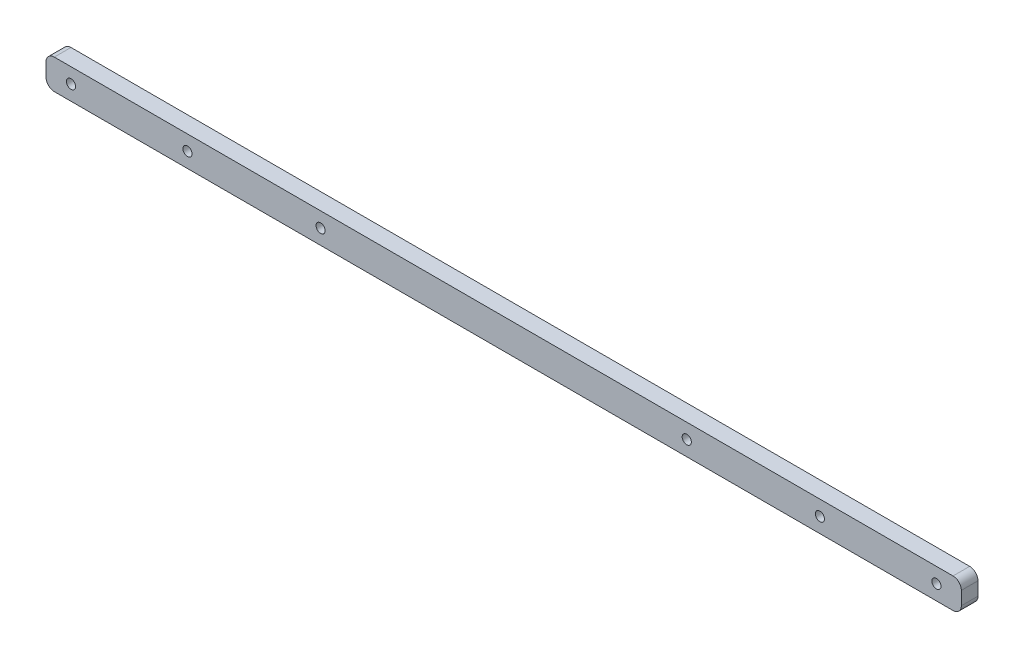
ISO-10303-21;
HEADER;
FILE_DESCRIPTION(('STEP AP214'),'2;1');
FILE_NAME('part.step','',(''),(''),'','','');
FILE_SCHEMA(('AUTOMOTIVE_DESIGN { 1 0 10303 214 1 1 1 1 }'));
ENDSEC;
DATA;
#1=APPLICATION_CONTEXT('core data for automotive mechanical design processes');
#2=APPLICATION_PROTOCOL_DEFINITION('international standard','automotive_design',2000,#1);
#3=PRODUCT_CONTEXT('',#1,'mechanical');
#4=PRODUCT('Part','Part','',(#3));
#5=PRODUCT_RELATED_PRODUCT_CATEGORY('part','',(#4));
#6=PRODUCT_DEFINITION_FORMATION('','',#4);
#7=PRODUCT_DEFINITION_CONTEXT('part definition',#1,'design');
#8=PRODUCT_DEFINITION('design','',#6,#7);
#9=PRODUCT_DEFINITION_SHAPE('','',#8);
#10=(LENGTH_UNIT() NAMED_UNIT(*) SI_UNIT(.MILLI.,.METRE.));
#11=(NAMED_UNIT(*) PLANE_ANGLE_UNIT() SI_UNIT($,.RADIAN.));
#12=(NAMED_UNIT(*) SI_UNIT($,.STERADIAN.) SOLID_ANGLE_UNIT());
#13=UNCERTAINTY_MEASURE_WITH_UNIT(LENGTH_MEASURE(1.E-05),#10,'distance_accuracy_value','');
#14=(GEOMETRIC_REPRESENTATION_CONTEXT(3) GLOBAL_UNCERTAINTY_ASSIGNED_CONTEXT((#13)) GLOBAL_UNIT_ASSIGNED_CONTEXT((#10,
#11,#12)) REPRESENTATION_CONTEXT('',''));
#15=CARTESIAN_POINT('',(0.,0.,0.));
#16=DIRECTION('',(0.,0.,1.));
#17=DIRECTION('',(1.,0.,0.));
#18=AXIS2_PLACEMENT_3D('',#15,#16,#17);
#19=CARTESIAN_POINT('',(0.,0.,10.));
#20=DIRECTION('',(0.,0.,1.));
#21=DIRECTION('',(1.,0.,0.));
#22=AXIS2_PLACEMENT_3D('',#19,#20,#21);
#23=PLANE('',#22);
#24=CARTESIAN_POINT('',(165.,-9.00000000000008,10.));
#25=DIRECTION('',(0.,0.,1.));
#26=DIRECTION('',(-1.,0.,0.));
#27=AXIS2_PLACEMENT_3D('',#24,#25,#26);
#28=CIRCLE('',#27,2.75000000000001);
#29=CARTESIAN_POINT('',(162.25,-9.00000000000008,10.));
#30=VERTEX_POINT('',#29);
#31=EDGE_CURVE('E207',#30,#30,#28,.T.);
#32=ORIENTED_EDGE('',*,*,#31,.F.);
#33=EDGE_LOOP('',(#32));
#34=FACE_BOUND('',#33,.T.);
#35=CARTESIAN_POINT('',(385.,-9.00000000000005,10.));
#36=DIRECTION('',(0.,0.,1.));
#37=DIRECTION('',(1.,0.,0.));
#38=AXIS2_PLACEMENT_3D('',#35,#36,#37);
#39=CIRCLE('',#38,2.74999999999998);
#40=CARTESIAN_POINT('',(387.75,-9.00000000000005,10.));
#41=VERTEX_POINT('',#40);
#42=EDGE_CURVE('E201',#41,#41,#39,.T.);
#43=ORIENTED_EDGE('',*,*,#42,.F.);
#44=EDGE_LOOP('',(#43));
#45=FACE_BOUND('',#44,.T.);
#46=CARTESIAN_POINT('',(465.,-9.,10.));
#47=DIRECTION('',(0.,0.,1.));
#48=DIRECTION('',(-1.,0.,0.));
#49=AXIS2_PLACEMENT_3D('',#46,#47,#48);
#50=CIRCLE('',#49,2.74999999999998);
#51=CARTESIAN_POINT('',(462.25,-9.,10.));
#52=VERTEX_POINT('',#51);
#53=EDGE_CURVE('E186',#52,#52,#50,.T.);
#54=ORIENTED_EDGE('',*,*,#53,.F.);
#55=EDGE_LOOP('',(#54));
#56=FACE_BOUND('',#55,.T.);
#57=CARTESIAN_POINT('',(15.,-9.,10.));
#58=DIRECTION('',(0.,0.,1.));
#59=DIRECTION('',(1.,0.,0.));
#60=AXIS2_PLACEMENT_3D('',#57,#58,#59);
#61=CIRCLE('',#60,2.75);
#62=CARTESIAN_POINT('',(17.75,-9.,10.));
#63=VERTEX_POINT('',#62);
#64=EDGE_CURVE('E170',#63,#63,#61,.T.);
#65=ORIENTED_EDGE('',*,*,#64,.F.);
#66=EDGE_LOOP('',(#65));
#67=FACE_BOUND('',#66,.T.);
#68=DIRECTION('',(0.,1.,0.));
#69=VECTOR('',#68,1.);
#70=CARTESIAN_POINT('',(550.,0.,10.));
#71=LINE('',#70,#69);
#72=CARTESIAN_POINT('',(550.,-13.,10.));
#73=VERTEX_POINT('',#72);
#74=CARTESIAN_POINT('',(550.,-5.,10.));
#75=VERTEX_POINT('',#74);
#76=EDGE_CURVE('E174',#73,#75,#71,.T.);
#77=ORIENTED_EDGE('',*,*,#76,.T.);
#78=CARTESIAN_POINT('',(545.,-5.,10.));
#79=DIRECTION('',(0.,0.,1.));
#80=DIRECTION('',(1.,0.,0.));
#81=AXIS2_PLACEMENT_3D('',#78,#79,#80);
#82=CIRCLE('',#81,5.);
#83=CARTESIAN_POINT('',(545.,0.,10.));
#84=VERTEX_POINT('',#83);
#85=EDGE_CURVE('E151',#75,#84,#82,.T.);
#86=ORIENTED_EDGE('',*,*,#85,.T.);
#87=DIRECTION('',(-1.,0.,0.));
#88=VECTOR('',#87,1.);
#89=CARTESIAN_POINT('',(0.,0.,10.));
#90=LINE('',#89,#88);
#91=CARTESIAN_POINT('',(5.,0.,10.));
#92=VERTEX_POINT('',#91);
#93=EDGE_CURVE('E122',#84,#92,#90,.T.);
#94=ORIENTED_EDGE('',*,*,#93,.T.);
#95=CARTESIAN_POINT('',(5.,-5.,10.));
#96=DIRECTION('',(0.,0.,1.));
#97=DIRECTION('',(1.,0.,0.));
#98=AXIS2_PLACEMENT_3D('',#95,#96,#97);
#99=CIRCLE('',#98,5.);
#100=CARTESIAN_POINT('',(0.,-5.,10.));
#101=VERTEX_POINT('',#100);
#102=EDGE_CURVE('E147',#92,#101,#99,.T.);
#103=ORIENTED_EDGE('',*,*,#102,.T.);
#104=DIRECTION('',(0.,-1.,0.));
#105=VECTOR('',#104,1.);
#106=CARTESIAN_POINT('',(0.,0.,10.));
#107=LINE('',#106,#105);
#108=CARTESIAN_POINT('',(0.,-13.,10.));
#109=VERTEX_POINT('',#108);
#110=EDGE_CURVE('E130',#101,#109,#107,.T.);
#111=ORIENTED_EDGE('',*,*,#110,.T.);
#112=CARTESIAN_POINT('',(5.,-13.,10.));
#113=DIRECTION('',(0.,0.,1.));
#114=DIRECTION('',(1.,0.,0.));
#115=AXIS2_PLACEMENT_3D('',#112,#113,#114);
#116=CIRCLE('',#115,5.);
#117=CARTESIAN_POINT('',(5.,-18.,10.));
#118=VERTEX_POINT('',#117);
#119=EDGE_CURVE('E57',#109,#118,#116,.T.);
#120=ORIENTED_EDGE('',*,*,#119,.T.);
#121=DIRECTION('',(1.,0.,0.));
#122=VECTOR('',#121,1.);
#123=CARTESIAN_POINT('',(0.,-18.,10.));
#124=LINE('',#123,#122);
#125=CARTESIAN_POINT('',(545.,-18.,10.));
#126=VERTEX_POINT('',#125);
#127=EDGE_CURVE('E133',#118,#126,#124,.T.);
#128=ORIENTED_EDGE('',*,*,#127,.T.);
#129=CARTESIAN_POINT('',(545.,-13.,10.));
#130=DIRECTION('',(0.,0.,1.));
#131=DIRECTION('',(1.,0.,0.));
#132=AXIS2_PLACEMENT_3D('',#129,#130,#131);
#133=CIRCLE('',#132,5.);
#134=EDGE_CURVE('E149',#126,#73,#133,.T.);
#135=ORIENTED_EDGE('',*,*,#134,.T.);
#136=EDGE_LOOP('',(#77,#86,#94,#103,#111,#120,#128,#135));
#137=FACE_BOUND('',#136,.T.);
#138=CARTESIAN_POINT('',(85.,-9.,10.));
#139=DIRECTION('',(0.,0.,1.));
#140=DIRECTION('',(1.,0.,0.));
#141=AXIS2_PLACEMENT_3D('',#138,#139,#140);
#142=CIRCLE('',#141,2.75000000000001);
#143=CARTESIAN_POINT('',(87.75,-9.,10.));
#144=VERTEX_POINT('',#143);
#145=EDGE_CURVE('E180',#144,#144,#142,.T.);
#146=ORIENTED_EDGE('',*,*,#145,.F.);
#147=EDGE_LOOP('',(#146));
#148=FACE_BOUND('',#147,.T.);
#149=CARTESIAN_POINT('',(535.,-9.,10.));
#150=DIRECTION('',(0.,0.,1.));
#151=DIRECTION('',(-1.,0.,0.));
#152=AXIS2_PLACEMENT_3D('',#149,#150,#151);
#153=CIRCLE('',#152,2.75000000000004);
#154=CARTESIAN_POINT('',(532.25,-9.,10.));
#155=VERTEX_POINT('',#154);
#156=EDGE_CURVE('E192',#155,#155,#153,.T.);
#157=ORIENTED_EDGE('',*,*,#156,.F.);
#158=EDGE_LOOP('',(#157));
#159=FACE_BOUND('',#158,.T.);
#160=ADVANCED_FACE('F35',(#34,#45,#56,#67,#137,#148,#159),#23,.T.);
#161=CARTESIAN_POINT('',(0.,0.,0.));
#162=DIRECTION('',(0.,0.,1.));
#163=DIRECTION('',(1.,0.,0.));
#164=AXIS2_PLACEMENT_3D('',#161,#162,#163);
#165=PLANE('',#164);
#166=CARTESIAN_POINT('',(165.,-9.00000000000008,0.));
#167=DIRECTION('',(0.,0.,1.));
#168=DIRECTION('',(-1.,0.,0.));
#169=AXIS2_PLACEMENT_3D('',#166,#167,#168);
#170=CIRCLE('',#169,2.75000000000001);
#171=CARTESIAN_POINT('',(162.25,-9.00000000000008,0.));
#172=VERTEX_POINT('',#171);
#173=EDGE_CURVE('E204',#172,#172,#170,.T.);
#174=ORIENTED_EDGE('',*,*,#173,.T.);
#175=EDGE_LOOP('',(#174));
#176=FACE_BOUND('',#175,.T.);
#177=CARTESIAN_POINT('',(385.,-9.00000000000005,0.));
#178=DIRECTION('',(0.,0.,1.));
#179=DIRECTION('',(1.,0.,0.));
#180=AXIS2_PLACEMENT_3D('',#177,#178,#179);
#181=CIRCLE('',#180,2.74999999999998);
#182=CARTESIAN_POINT('',(387.75,-9.00000000000005,0.));
#183=VERTEX_POINT('',#182);
#184=EDGE_CURVE('E198',#183,#183,#181,.T.);
#185=ORIENTED_EDGE('',*,*,#184,.T.);
#186=EDGE_LOOP('',(#185));
#187=FACE_BOUND('',#186,.T.);
#188=DIRECTION('',(-1.,0.,0.));
#189=VECTOR('',#188,1.);
#190=CARTESIAN_POINT('',(0.,0.,0.));
#191=LINE('',#190,#189);
#192=CARTESIAN_POINT('',(545.,0.,0.));
#193=VERTEX_POINT('',#192);
#194=CARTESIAN_POINT('',(5.,0.,0.));
#195=VERTEX_POINT('',#194);
#196=EDGE_CURVE('E119',#193,#195,#191,.T.);
#197=ORIENTED_EDGE('',*,*,#196,.F.);
#198=CARTESIAN_POINT('',(545.,-5.,0.));
#199=DIRECTION('',(0.,0.,1.));
#200=DIRECTION('',(1.,0.,0.));
#201=AXIS2_PLACEMENT_3D('',#198,#199,#200);
#202=CIRCLE('',#201,5.);
#203=CARTESIAN_POINT('',(550.,-5.,0.));
#204=VERTEX_POINT('',#203);
#205=EDGE_CURVE('E102',#193,#204,#202,.F.);
#206=ORIENTED_EDGE('',*,*,#205,.T.);
#207=DIRECTION('',(0.,1.,0.));
#208=VECTOR('',#207,1.);
#209=CARTESIAN_POINT('',(550.,0.,0.));
#210=LINE('',#209,#208);
#211=CARTESIAN_POINT('',(550.,-13.,0.));
#212=VERTEX_POINT('',#211);
#213=EDGE_CURVE('E131',#212,#204,#210,.T.);
#214=ORIENTED_EDGE('',*,*,#213,.F.);
#215=CARTESIAN_POINT('',(545.,-13.,0.));
#216=DIRECTION('',(0.,0.,1.));
#217=DIRECTION('',(1.,0.,0.));
#218=AXIS2_PLACEMENT_3D('',#215,#216,#217);
#219=CIRCLE('',#218,5.);
#220=CARTESIAN_POINT('',(545.,-18.,0.));
#221=VERTEX_POINT('',#220);
#222=EDGE_CURVE('E113',#212,#221,#219,.F.);
#223=ORIENTED_EDGE('',*,*,#222,.T.);
#224=DIRECTION('',(1.,0.,0.));
#225=VECTOR('',#224,1.);
#226=CARTESIAN_POINT('',(0.,-18.,0.));
#227=LINE('',#226,#225);
#228=CARTESIAN_POINT('',(5.,-18.,0.));
#229=VERTEX_POINT('',#228);
#230=EDGE_CURVE('E135',#229,#221,#227,.T.);
#231=ORIENTED_EDGE('',*,*,#230,.F.);
#232=CARTESIAN_POINT('',(5.,-13.,0.));
#233=DIRECTION('',(0.,0.,1.));
#234=DIRECTION('',(1.,0.,0.));
#235=AXIS2_PLACEMENT_3D('',#232,#233,#234);
#236=CIRCLE('',#235,5.);
#237=CARTESIAN_POINT('',(0.,-13.,0.));
#238=VERTEX_POINT('',#237);
#239=EDGE_CURVE('E123',#229,#238,#236,.F.);
#240=ORIENTED_EDGE('',*,*,#239,.T.);
#241=DIRECTION('',(0.,-1.,0.));
#242=VECTOR('',#241,1.);
#243=CARTESIAN_POINT('',(0.,0.,0.));
#244=LINE('',#243,#242);
#245=CARTESIAN_POINT('',(0.,-5.,0.));
#246=VERTEX_POINT('',#245);
#247=EDGE_CURVE('E162',#246,#238,#244,.T.);
#248=ORIENTED_EDGE('',*,*,#247,.F.);
#249=CARTESIAN_POINT('',(5.,-5.,0.));
#250=DIRECTION('',(0.,0.,1.));
#251=DIRECTION('',(1.,0.,0.));
#252=AXIS2_PLACEMENT_3D('',#249,#250,#251);
#253=CIRCLE('',#252,5.);
#254=EDGE_CURVE('E129',#246,#195,#253,.F.);
#255=ORIENTED_EDGE('',*,*,#254,.T.);
#256=EDGE_LOOP('',(#197,#206,#214,#223,#231,#240,#248,#255));
#257=FACE_BOUND('',#256,.T.);
#258=CARTESIAN_POINT('',(15.,-9.,0.));
#259=DIRECTION('',(0.,0.,1.));
#260=DIRECTION('',(1.,0.,0.));
#261=AXIS2_PLACEMENT_3D('',#258,#259,#260);
#262=CIRCLE('',#261,2.75);
#263=CARTESIAN_POINT('',(17.75,-9.,0.));
#264=VERTEX_POINT('',#263);
#265=EDGE_CURVE('E177',#264,#264,#262,.T.);
#266=ORIENTED_EDGE('',*,*,#265,.T.);
#267=EDGE_LOOP('',(#266));
#268=FACE_BOUND('',#267,.T.);
#269=CARTESIAN_POINT('',(85.,-9.,0.));
#270=DIRECTION('',(0.,0.,1.));
#271=DIRECTION('',(1.,0.,0.));
#272=AXIS2_PLACEMENT_3D('',#269,#270,#271);
#273=CIRCLE('',#272,2.75000000000001);
#274=CARTESIAN_POINT('',(87.75,-9.,0.));
#275=VERTEX_POINT('',#274);
#276=EDGE_CURVE('E183',#275,#275,#273,.T.);
#277=ORIENTED_EDGE('',*,*,#276,.T.);
#278=EDGE_LOOP('',(#277));
#279=FACE_BOUND('',#278,.T.);
#280=CARTESIAN_POINT('',(465.,-9.,0.));
#281=DIRECTION('',(0.,0.,1.));
#282=DIRECTION('',(-1.,0.,0.));
#283=AXIS2_PLACEMENT_3D('',#280,#281,#282);
#284=CIRCLE('',#283,2.74999999999998);
#285=CARTESIAN_POINT('',(462.25,-9.,0.));
#286=VERTEX_POINT('',#285);
#287=EDGE_CURVE('E189',#286,#286,#284,.T.);
#288=ORIENTED_EDGE('',*,*,#287,.T.);
#289=EDGE_LOOP('',(#288));
#290=FACE_BOUND('',#289,.T.);
#291=CARTESIAN_POINT('',(535.,-9.,0.));
#292=DIRECTION('',(0.,0.,1.));
#293=DIRECTION('',(-1.,0.,0.));
#294=AXIS2_PLACEMENT_3D('',#291,#292,#293);
#295=CIRCLE('',#294,2.75000000000004);
#296=CARTESIAN_POINT('',(532.25,-9.,0.));
#297=VERTEX_POINT('',#296);
#298=EDGE_CURVE('E195',#297,#297,#295,.T.);
#299=ORIENTED_EDGE('',*,*,#298,.T.);
#300=EDGE_LOOP('',(#299));
#301=FACE_BOUND('',#300,.T.);
#302=ADVANCED_FACE('F126',(#176,#187,#257,#268,#279,#290,#301),#165,.F.);
#303=CARTESIAN_POINT('',(0.,0.,10.));
#304=DIRECTION('',(1.,0.,0.));
#305=DIRECTION('',(0.,1.,0.));
#306=AXIS2_PLACEMENT_3D('',#303,#304,#305);
#307=PLANE('',#306);
#308=ORIENTED_EDGE('',*,*,#110,.F.);
#309=DIRECTION('',(0.,0.,-1.));
#310=VECTOR('',#309,1.);
#311=CARTESIAN_POINT('',(0.,-5.,10.));
#312=LINE('',#311,#310);
#313=EDGE_CURVE('E11',#101,#246,#312,.T.);
#314=ORIENTED_EDGE('',*,*,#313,.T.);
#315=ORIENTED_EDGE('',*,*,#247,.T.);
#316=DIRECTION('',(0.,0.,-1.));
#317=VECTOR('',#316,1.);
#318=CARTESIAN_POINT('',(0.,-13.,10.));
#319=LINE('',#318,#317);
#320=EDGE_CURVE('E43',#238,#109,#319,.F.);
#321=ORIENTED_EDGE('',*,*,#320,.T.);
#322=EDGE_LOOP('',(#308,#314,#315,#321));
#323=FACE_BOUND('',#322,.T.);
#324=ADVANCED_FACE('F160',(#323),#307,.F.);
#325=CARTESIAN_POINT('',(0.,-18.,10.));
#326=DIRECTION('',(0.,1.,0.));
#327=DIRECTION('',(0.,0.,1.));
#328=AXIS2_PLACEMENT_3D('',#325,#326,#327);
#329=PLANE('',#328);
#330=ORIENTED_EDGE('',*,*,#230,.T.);
#331=DIRECTION('',(0.,0.,-1.));
#332=VECTOR('',#331,1.);
#333=CARTESIAN_POINT('',(545.,-18.,10.));
#334=LINE('',#333,#332);
#335=EDGE_CURVE('E50',#221,#126,#334,.F.);
#336=ORIENTED_EDGE('',*,*,#335,.T.);
#337=ORIENTED_EDGE('',*,*,#127,.F.);
#338=DIRECTION('',(0.,0.,-1.));
#339=VECTOR('',#338,1.);
#340=CARTESIAN_POINT('',(5.,-18.,10.));
#341=LINE('',#340,#339);
#342=EDGE_CURVE('E153',#118,#229,#341,.T.);
#343=ORIENTED_EDGE('',*,*,#342,.T.);
#344=EDGE_LOOP('',(#330,#336,#337,#343));
#345=FACE_BOUND('',#344,.T.);
#346=ADVANCED_FACE('F169',(#345),#329,.F.);
#347=CARTESIAN_POINT('',(550.,0.,10.));
#348=DIRECTION('',(-1.,0.,0.));
#349=DIRECTION('',(0.,0.,1.));
#350=AXIS2_PLACEMENT_3D('',#347,#348,#349);
#351=PLANE('',#350);
#352=ORIENTED_EDGE('',*,*,#213,.T.);
#353=DIRECTION('',(0.,0.,-1.));
#354=VECTOR('',#353,1.);
#355=CARTESIAN_POINT('',(550.,-5.,10.));
#356=LINE('',#355,#354);
#357=EDGE_CURVE('E107',#204,#75,#356,.F.);
#358=ORIENTED_EDGE('',*,*,#357,.T.);
#359=ORIENTED_EDGE('',*,*,#76,.F.);
#360=DIRECTION('',(0.,0.,-1.));
#361=VECTOR('',#360,1.);
#362=CARTESIAN_POINT('',(550.,-13.,10.));
#363=LINE('',#362,#361);
#364=EDGE_CURVE('E112',#73,#212,#363,.T.);
#365=ORIENTED_EDGE('',*,*,#364,.T.);
#366=EDGE_LOOP('',(#352,#358,#359,#365));
#367=FACE_BOUND('',#366,.T.);
#368=ADVANCED_FACE('F266',(#367),#351,.F.);
#369=CARTESIAN_POINT('',(0.,0.,10.));
#370=DIRECTION('',(0.,-1.,0.));
#371=DIRECTION('',(0.,0.,-1.));
#372=AXIS2_PLACEMENT_3D('',#369,#370,#371);
#373=PLANE('',#372);
#374=ORIENTED_EDGE('',*,*,#93,.F.);
#375=DIRECTION('',(0.,0.,-1.));
#376=VECTOR('',#375,1.);
#377=CARTESIAN_POINT('',(545.,0.,10.));
#378=LINE('',#377,#376);
#379=EDGE_CURVE('E106',#84,#193,#378,.T.);
#380=ORIENTED_EDGE('',*,*,#379,.T.);
#381=ORIENTED_EDGE('',*,*,#196,.T.);
#382=DIRECTION('',(0.,0.,-1.));
#383=VECTOR('',#382,1.);
#384=CARTESIAN_POINT('',(5.,0.,10.));
#385=LINE('',#384,#383);
#386=EDGE_CURVE('E124',#195,#92,#385,.F.);
#387=ORIENTED_EDGE('',*,*,#386,.T.);
#388=EDGE_LOOP('',(#374,#380,#381,#387));
#389=FACE_BOUND('',#388,.T.);
#390=ADVANCED_FACE('F118',(#389),#373,.F.);
#391=CARTESIAN_POINT('',(15.,-9.,10.));
#392=DIRECTION('',(0.,0.,-1.));
#393=DIRECTION('',(-1.,0.,0.));
#394=AXIS2_PLACEMENT_3D('',#391,#392,#393);
#395=CYLINDRICAL_SURFACE('',#394,2.75);
#396=ORIENTED_EDGE('',*,*,#64,.T.);
#397=EDGE_LOOP('',(#396));
#398=FACE_BOUND('',#397,.T.);
#399=ORIENTED_EDGE('',*,*,#265,.F.);
#400=EDGE_LOOP('',(#399));
#401=FACE_BOUND('',#400,.T.);
#402=ADVANCED_FACE('F231',(#398,#401),#395,.F.);
#403=CARTESIAN_POINT('',(85.,-9.,10.));
#404=DIRECTION('',(0.,0.,-1.));
#405=DIRECTION('',(-1.,0.,0.));
#406=AXIS2_PLACEMENT_3D('',#403,#404,#405);
#407=CYLINDRICAL_SURFACE('',#406,2.75000000000001);
#408=ORIENTED_EDGE('',*,*,#145,.T.);
#409=EDGE_LOOP('',(#408));
#410=FACE_BOUND('',#409,.T.);
#411=ORIENTED_EDGE('',*,*,#276,.F.);
#412=EDGE_LOOP('',(#411));
#413=FACE_BOUND('',#412,.T.);
#414=ADVANCED_FACE('F234',(#410,#413),#407,.F.);
#415=CARTESIAN_POINT('',(465.,-9.,10.));
#416=DIRECTION('',(0.,0.,-1.));
#417=DIRECTION('',(-1.,0.,0.));
#418=AXIS2_PLACEMENT_3D('',#415,#416,#417);
#419=CYLINDRICAL_SURFACE('',#418,2.74999999999998);
#420=ORIENTED_EDGE('',*,*,#53,.T.);
#421=EDGE_LOOP('',(#420));
#422=FACE_BOUND('',#421,.T.);
#423=ORIENTED_EDGE('',*,*,#287,.F.);
#424=EDGE_LOOP('',(#423));
#425=FACE_BOUND('',#424,.T.);
#426=ADVANCED_FACE('F248',(#422,#425),#419,.F.);
#427=CARTESIAN_POINT('',(535.,-9.,10.));
#428=DIRECTION('',(0.,0.,-1.));
#429=DIRECTION('',(-1.,0.,0.));
#430=AXIS2_PLACEMENT_3D('',#427,#428,#429);
#431=CYLINDRICAL_SURFACE('',#430,2.75000000000004);
#432=ORIENTED_EDGE('',*,*,#156,.T.);
#433=EDGE_LOOP('',(#432));
#434=FACE_BOUND('',#433,.T.);
#435=ORIENTED_EDGE('',*,*,#298,.F.);
#436=EDGE_LOOP('',(#435));
#437=FACE_BOUND('',#436,.T.);
#438=ADVANCED_FACE('F246',(#434,#437),#431,.F.);
#439=CARTESIAN_POINT('',(545.,-5.,10.));
#440=DIRECTION('',(0.,0.,-1.));
#441=DIRECTION('',(-1.,0.,0.));
#442=AXIS2_PLACEMENT_3D('',#439,#440,#441);
#443=CYLINDRICAL_SURFACE('',#442,5.);
#444=ORIENTED_EDGE('',*,*,#85,.F.);
#445=ORIENTED_EDGE('',*,*,#357,.F.);
#446=ORIENTED_EDGE('',*,*,#205,.F.);
#447=ORIENTED_EDGE('',*,*,#379,.F.);
#448=EDGE_LOOP('',(#444,#445,#446,#447));
#449=FACE_BOUND('',#448,.T.);
#450=ADVANCED_FACE('F105',(#449),#443,.T.);
#451=CARTESIAN_POINT('',(545.,-13.,10.));
#452=DIRECTION('',(0.,0.,-1.));
#453=DIRECTION('',(-1.,0.,0.));
#454=AXIS2_PLACEMENT_3D('',#451,#452,#453);
#455=CYLINDRICAL_SURFACE('',#454,5.);
#456=ORIENTED_EDGE('',*,*,#134,.F.);
#457=ORIENTED_EDGE('',*,*,#335,.F.);
#458=ORIENTED_EDGE('',*,*,#222,.F.);
#459=ORIENTED_EDGE('',*,*,#364,.F.);
#460=EDGE_LOOP('',(#456,#457,#458,#459));
#461=FACE_BOUND('',#460,.T.);
#462=ADVANCED_FACE('F255',(#461),#455,.T.);
#463=CARTESIAN_POINT('',(5.,-5.,10.));
#464=DIRECTION('',(0.,0.,-1.));
#465=DIRECTION('',(-1.,0.,0.));
#466=AXIS2_PLACEMENT_3D('',#463,#464,#465);
#467=CYLINDRICAL_SURFACE('',#466,5.);
#468=ORIENTED_EDGE('',*,*,#102,.F.);
#469=ORIENTED_EDGE('',*,*,#386,.F.);
#470=ORIENTED_EDGE('',*,*,#254,.F.);
#471=ORIENTED_EDGE('',*,*,#313,.F.);
#472=EDGE_LOOP('',(#468,#469,#470,#471));
#473=FACE_BOUND('',#472,.T.);
#474=ADVANCED_FACE('F275',(#473),#467,.T.);
#475=CARTESIAN_POINT('',(5.,-13.,10.));
#476=DIRECTION('',(0.,0.,-1.));
#477=DIRECTION('',(-1.,0.,0.));
#478=AXIS2_PLACEMENT_3D('',#475,#476,#477);
#479=CYLINDRICAL_SURFACE('',#478,5.);
#480=ORIENTED_EDGE('',*,*,#119,.F.);
#481=ORIENTED_EDGE('',*,*,#320,.F.);
#482=ORIENTED_EDGE('',*,*,#239,.F.);
#483=ORIENTED_EDGE('',*,*,#342,.F.);
#484=EDGE_LOOP('',(#480,#481,#482,#483));
#485=FACE_BOUND('',#484,.T.);
#486=ADVANCED_FACE('F37',(#485),#479,.T.);
#487=CARTESIAN_POINT('',(385.,-9.00000000000005,0.));
#488=DIRECTION('',(0.,0.,1.));
#489=DIRECTION('',(1.,0.,0.));
#490=AXIS2_PLACEMENT_3D('',#487,#488,#489);
#491=CYLINDRICAL_SURFACE('',#490,2.74999999999998);
#492=ORIENTED_EDGE('',*,*,#184,.F.);
#493=EDGE_LOOP('',(#492));
#494=FACE_BOUND('',#493,.T.);
#495=ORIENTED_EDGE('',*,*,#42,.T.);
#496=EDGE_LOOP('',(#495));
#497=FACE_BOUND('',#496,.T.);
#498=ADVANCED_FACE('F218',(#494,#497),#491,.F.);
#499=CARTESIAN_POINT('',(165.,-9.00000000000008,0.));
#500=DIRECTION('',(0.,0.,1.));
#501=DIRECTION('',(1.,0.,0.));
#502=AXIS2_PLACEMENT_3D('',#499,#500,#501);
#503=CYLINDRICAL_SURFACE('',#502,2.75000000000001);
#504=ORIENTED_EDGE('',*,*,#173,.F.);
#505=EDGE_LOOP('',(#504));
#506=FACE_BOUND('',#505,.T.);
#507=ORIENTED_EDGE('',*,*,#31,.T.);
#508=EDGE_LOOP('',(#507));
#509=FACE_BOUND('',#508,.T.);
#510=ADVANCED_FACE('F215',(#506,#509),#503,.F.);
#511=CLOSED_SHELL('',(#160,#302,#324,#346,#368,#390,#402,#414,#426,#438,#450,#462,#474,#486,
#498,#510));
#512=MANIFOLD_SOLID_BREP('B2',#511);
#513=ADVANCED_BREP_SHAPE_REPRESENTATION('',(#18,#512),#14);
#514=SHAPE_DEFINITION_REPRESENTATION(#9,#513);
ENDSEC;
END-ISO-10303-21;
